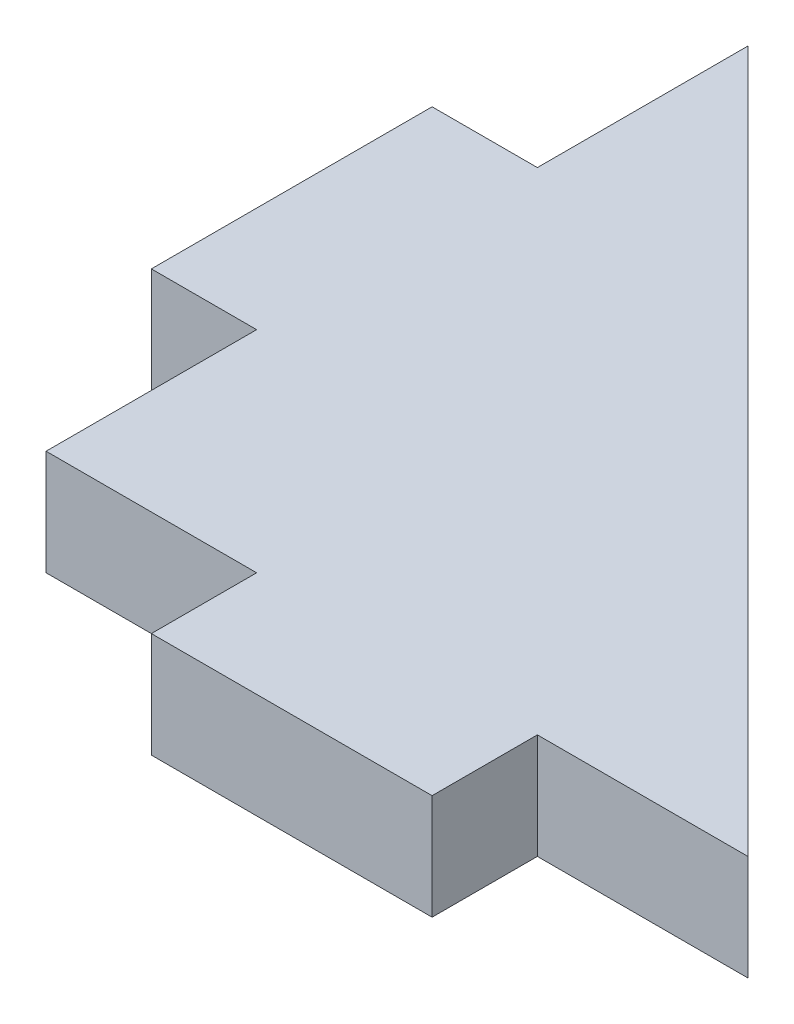
ISO-10303-21;
HEADER;
FILE_DESCRIPTION(('STEP AP214'),'2;1');
FILE_NAME('part.step','',(''),(''),'','','');
FILE_SCHEMA(('AUTOMOTIVE_DESIGN { 1 0 10303 214 1 1 1 1 }'));
ENDSEC;
DATA;
#1=APPLICATION_CONTEXT('core data for automotive mechanical design processes');
#2=APPLICATION_PROTOCOL_DEFINITION('international standard','automotive_design',2000,#1);
#3=PRODUCT_CONTEXT('',#1,'mechanical');
#4=PRODUCT('Part','Part','',(#3));
#5=PRODUCT_RELATED_PRODUCT_CATEGORY('part','',(#4));
#6=PRODUCT_DEFINITION_FORMATION('','',#4);
#7=PRODUCT_DEFINITION_CONTEXT('part definition',#1,'design');
#8=PRODUCT_DEFINITION('design','',#6,#7);
#9=PRODUCT_DEFINITION_SHAPE('','',#8);
#10=(LENGTH_UNIT() NAMED_UNIT(*) SI_UNIT(.MILLI.,.METRE.));
#11=(NAMED_UNIT(*) PLANE_ANGLE_UNIT() SI_UNIT($,.RADIAN.));
#12=(NAMED_UNIT(*) SI_UNIT($,.STERADIAN.) SOLID_ANGLE_UNIT());
#13=UNCERTAINTY_MEASURE_WITH_UNIT(LENGTH_MEASURE(1.E-05),#10,'distance_accuracy_value','');
#14=(GEOMETRIC_REPRESENTATION_CONTEXT(3) GLOBAL_UNCERTAINTY_ASSIGNED_CONTEXT((#13)) GLOBAL_UNIT_ASSIGNED_CONTEXT((#10,
#11,#12)) REPRESENTATION_CONTEXT('',''));
#15=CARTESIAN_POINT('',(0.,0.,0.));
#16=DIRECTION('',(0.,0.,1.));
#17=DIRECTION('',(1.,0.,0.));
#18=AXIS2_PLACEMENT_3D('',#15,#16,#17);
#19=CARTESIAN_POINT('',(0.,3.,0.));
#20=DIRECTION('',(1.,0.,0.));
#21=DIRECTION('',(0.,0.,-1.));
#22=AXIS2_PLACEMENT_3D('',#19,#20,#21);
#23=PLANE('',#22);
#24=DIRECTION('',(0.,0.,1.));
#25=VECTOR('',#24,1.);
#26=CARTESIAN_POINT('',(0.,0.,0.));
#27=LINE('',#26,#25);
#28=CARTESIAN_POINT('',(0.,0.,-6.));
#29=VERTEX_POINT('',#28);
#30=CARTESIAN_POINT('',(0.,0.,0.));
#31=VERTEX_POINT('',#30);
#32=EDGE_CURVE('E147',#29,#31,#27,.T.);
#33=ORIENTED_EDGE('',*,*,#32,.T.);
#34=DIRECTION('',(0.,-1.,0.));
#35=VECTOR('',#34,1.);
#36=CARTESIAN_POINT('',(0.,3.,0.));
#37=LINE('',#36,#35);
#38=CARTESIAN_POINT('',(0.,3.,0.));
#39=VERTEX_POINT('',#38);
#40=EDGE_CURVE('E11',#39,#31,#37,.T.);
#41=ORIENTED_EDGE('',*,*,#40,.F.);
#42=DIRECTION('',(0.,0.,1.));
#43=VECTOR('',#42,1.);
#44=CARTESIAN_POINT('',(0.,3.,0.));
#45=LINE('',#44,#43);
#46=CARTESIAN_POINT('',(0.,3.,-6.));
#47=VERTEX_POINT('',#46);
#48=EDGE_CURVE('E168',#47,#39,#45,.T.);
#49=ORIENTED_EDGE('',*,*,#48,.F.);
#50=DIRECTION('',(0.,-1.,0.));
#51=VECTOR('',#50,1.);
#52=CARTESIAN_POINT('',(0.,3.,-6.));
#53=LINE('',#52,#51);
#54=EDGE_CURVE('E143',#47,#29,#53,.T.);
#55=ORIENTED_EDGE('',*,*,#54,.T.);
#56=EDGE_LOOP('',(#33,#41,#49,#55));
#57=FACE_BOUND('',#56,.T.);
#58=ADVANCED_FACE('F33',(#57),#23,.F.);
#59=CARTESIAN_POINT('',(0.,3.,0.));
#60=DIRECTION('',(0.,0.,-1.));
#61=DIRECTION('',(-1.,0.,0.));
#62=AXIS2_PLACEMENT_3D('',#59,#60,#61);
#63=PLANE('',#62);
#64=DIRECTION('',(1.,0.,0.));
#65=VECTOR('',#64,1.);
#66=CARTESIAN_POINT('',(0.,0.,0.));
#67=LINE('',#66,#65);
#68=CARTESIAN_POINT('',(6.,0.,0.));
#69=VERTEX_POINT('',#68);
#70=EDGE_CURVE('E150',#31,#69,#67,.T.);
#71=ORIENTED_EDGE('',*,*,#70,.T.);
#72=DIRECTION('',(0.,-1.,0.));
#73=VECTOR('',#72,1.);
#74=CARTESIAN_POINT('',(6.,3.,0.));
#75=LINE('',#74,#73);
#76=CARTESIAN_POINT('',(6.,3.,0.));
#77=VERTEX_POINT('',#76);
#78=EDGE_CURVE('E41',#77,#69,#75,.T.);
#79=ORIENTED_EDGE('',*,*,#78,.F.);
#80=DIRECTION('',(1.,0.,0.));
#81=VECTOR('',#80,1.);
#82=CARTESIAN_POINT('',(0.,3.,0.));
#83=LINE('',#82,#81);
#84=EDGE_CURVE('E100',#39,#77,#83,.T.);
#85=ORIENTED_EDGE('',*,*,#84,.F.);
#86=ORIENTED_EDGE('',*,*,#40,.T.);
#87=EDGE_LOOP('',(#71,#79,#85,#86));
#88=FACE_BOUND('',#87,.T.);
#89=ADVANCED_FACE('F239',(#88),#63,.F.);
#90=CARTESIAN_POINT('',(6.,3.,3.));
#91=DIRECTION('',(1.,0.,0.));
#92=DIRECTION('',(0.,0.,-1.));
#93=AXIS2_PLACEMENT_3D('',#90,#91,#92);
#94=PLANE('',#93);
#95=DIRECTION('',(0.,0.,1.));
#96=VECTOR('',#95,1.);
#97=CARTESIAN_POINT('',(6.,0.,3.));
#98=LINE('',#97,#96);
#99=CARTESIAN_POINT('',(6.,0.,3.));
#100=VERTEX_POINT('',#99);
#101=EDGE_CURVE('E152',#69,#100,#98,.T.);
#102=ORIENTED_EDGE('',*,*,#101,.T.);
#103=DIRECTION('',(0.,-1.,0.));
#104=VECTOR('',#103,1.);
#105=CARTESIAN_POINT('',(6.,3.,3.));
#106=LINE('',#105,#104);
#107=CARTESIAN_POINT('',(6.,3.,3.));
#108=VERTEX_POINT('',#107);
#109=EDGE_CURVE('E184',#108,#100,#106,.T.);
#110=ORIENTED_EDGE('',*,*,#109,.F.);
#111=DIRECTION('',(0.,0.,1.));
#112=VECTOR('',#111,1.);
#113=CARTESIAN_POINT('',(6.,3.,3.));
#114=LINE('',#113,#112);
#115=EDGE_CURVE('E192',#77,#108,#114,.T.);
#116=ORIENTED_EDGE('',*,*,#115,.F.);
#117=ORIENTED_EDGE('',*,*,#78,.T.);
#118=EDGE_LOOP('',(#102,#110,#116,#117));
#119=FACE_BOUND('',#118,.T.);
#120=ADVANCED_FACE('F190',(#119),#94,.F.);
#121=CARTESIAN_POINT('',(10.,3.,3.));
#122=DIRECTION('',(0.,0.,-1.));
#123=DIRECTION('',(-1.,0.,0.));
#124=AXIS2_PLACEMENT_3D('',#121,#122,#123);
#125=PLANE('',#124);
#126=DIRECTION('',(1.,0.,0.));
#127=VECTOR('',#126,1.);
#128=CARTESIAN_POINT('',(10.,0.,3.));
#129=LINE('',#128,#127);
#130=CARTESIAN_POINT('',(14.,0.,3.));
#131=VERTEX_POINT('',#130);
#132=EDGE_CURVE('E155',#100,#131,#129,.T.);
#133=ORIENTED_EDGE('',*,*,#132,.T.);
#134=DIRECTION('',(0.,-1.,0.));
#135=VECTOR('',#134,1.);
#136=CARTESIAN_POINT('',(14.,3.,3.));
#137=LINE('',#136,#135);
#138=CARTESIAN_POINT('',(14.,3.,3.));
#139=VERTEX_POINT('',#138);
#140=EDGE_CURVE('E181',#139,#131,#137,.T.);
#141=ORIENTED_EDGE('',*,*,#140,.F.);
#142=DIRECTION('',(1.,0.,0.));
#143=VECTOR('',#142,1.);
#144=CARTESIAN_POINT('',(10.,3.,3.));
#145=LINE('',#144,#143);
#146=EDGE_CURVE('E209',#108,#139,#145,.T.);
#147=ORIENTED_EDGE('',*,*,#146,.F.);
#148=ORIENTED_EDGE('',*,*,#109,.T.);
#149=EDGE_LOOP('',(#133,#141,#147,#148));
#150=FACE_BOUND('',#149,.T.);
#151=ADVANCED_FACE('F200',(#150),#125,.F.);
#152=CARTESIAN_POINT('',(14.,3.,3.));
#153=DIRECTION('',(-1.,0.,0.));
#154=DIRECTION('',(0.,0.,1.));
#155=AXIS2_PLACEMENT_3D('',#152,#153,#154);
#156=PLANE('',#155);
#157=DIRECTION('',(0.,0.,-1.));
#158=VECTOR('',#157,1.);
#159=CARTESIAN_POINT('',(14.,0.,3.));
#160=LINE('',#159,#158);
#161=CARTESIAN_POINT('',(14.,0.,0.));
#162=VERTEX_POINT('',#161);
#163=EDGE_CURVE('E157',#131,#162,#160,.T.);
#164=ORIENTED_EDGE('',*,*,#163,.T.);
#165=DIRECTION('',(0.,-1.,0.));
#166=VECTOR('',#165,1.);
#167=CARTESIAN_POINT('',(14.,3.,0.));
#168=LINE('',#167,#166);
#169=CARTESIAN_POINT('',(14.,3.,0.));
#170=VERTEX_POINT('',#169);
#171=EDGE_CURVE('E178',#170,#162,#168,.T.);
#172=ORIENTED_EDGE('',*,*,#171,.F.);
#173=DIRECTION('',(0.,0.,-1.));
#174=VECTOR('',#173,1.);
#175=CARTESIAN_POINT('',(14.,3.,3.));
#176=LINE('',#175,#174);
#177=EDGE_CURVE('E206',#139,#170,#176,.T.);
#178=ORIENTED_EDGE('',*,*,#177,.F.);
#179=ORIENTED_EDGE('',*,*,#140,.T.);
#180=EDGE_LOOP('',(#164,#172,#178,#179));
#181=FACE_BOUND('',#180,.T.);
#182=ADVANCED_FACE('F204',(#181),#156,.F.);
#183=CARTESIAN_POINT('',(14.,3.,0.));
#184=DIRECTION('',(0.,0.,-1.));
#185=DIRECTION('',(-1.,0.,0.));
#186=AXIS2_PLACEMENT_3D('',#183,#184,#185);
#187=PLANE('',#186);
#188=DIRECTION('',(1.,0.,0.));
#189=VECTOR('',#188,1.);
#190=CARTESIAN_POINT('',(14.,0.,0.));
#191=LINE('',#190,#189);
#192=CARTESIAN_POINT('',(20.,0.,0.));
#193=VERTEX_POINT('',#192);
#194=EDGE_CURVE('E159',#162,#193,#191,.T.);
#195=ORIENTED_EDGE('',*,*,#194,.T.);
#196=DIRECTION('',(0.,-1.,0.));
#197=VECTOR('',#196,1.);
#198=CARTESIAN_POINT('',(20.,3.,0.));
#199=LINE('',#198,#197);
#200=CARTESIAN_POINT('',(20.,3.,0.));
#201=VERTEX_POINT('',#200);
#202=EDGE_CURVE('E175',#201,#193,#199,.T.);
#203=ORIENTED_EDGE('',*,*,#202,.F.);
#204=DIRECTION('',(1.,0.,0.));
#205=VECTOR('',#204,1.);
#206=CARTESIAN_POINT('',(14.,3.,0.));
#207=LINE('',#206,#205);
#208=EDGE_CURVE('E208',#170,#201,#207,.T.);
#209=ORIENTED_EDGE('',*,*,#208,.F.);
#210=ORIENTED_EDGE('',*,*,#171,.T.);
#211=EDGE_LOOP('',(#195,#203,#209,#210));
#212=FACE_BOUND('',#211,.T.);
#213=ADVANCED_FACE('F252',(#212),#187,.F.);
#214=CARTESIAN_POINT('',(0.,3.,-20.));
#215=DIRECTION('',(-0.707106781186547,0.,0.707106781186547));
#216=DIRECTION('',(0.707106781186548,0.,0.707106781186548));
#217=AXIS2_PLACEMENT_3D('',#214,#215,#216);
#218=PLANE('',#217);
#219=DIRECTION('',(-0.707106781186548,0.,-0.707106781186548));
#220=VECTOR('',#219,1.);
#221=CARTESIAN_POINT('',(0.,0.,-20.));
#222=LINE('',#221,#220);
#223=CARTESIAN_POINT('',(0.,0.,-20.));
#224=VERTEX_POINT('',#223);
#225=EDGE_CURVE('E161',#193,#224,#222,.T.);
#226=ORIENTED_EDGE('',*,*,#225,.T.);
#227=DIRECTION('',(0.,-1.,0.));
#228=VECTOR('',#227,1.);
#229=CARTESIAN_POINT('',(0.,3.,-20.));
#230=LINE('',#229,#228);
#231=CARTESIAN_POINT('',(0.,3.,-20.));
#232=VERTEX_POINT('',#231);
#233=EDGE_CURVE('E172',#232,#224,#230,.T.);
#234=ORIENTED_EDGE('',*,*,#233,.F.);
#235=DIRECTION('',(-0.707106781186548,0.,-0.707106781186548));
#236=VECTOR('',#235,1.);
#237=CARTESIAN_POINT('',(0.,3.,-20.));
#238=LINE('',#237,#236);
#239=EDGE_CURVE('E211',#201,#232,#238,.T.);
#240=ORIENTED_EDGE('',*,*,#239,.F.);
#241=ORIENTED_EDGE('',*,*,#202,.T.);
#242=EDGE_LOOP('',(#226,#234,#240,#241));
#243=FACE_BOUND('',#242,.T.);
#244=ADVANCED_FACE('F220',(#243),#218,.F.);
#245=CARTESIAN_POINT('',(0.,3.,-14.));
#246=DIRECTION('',(1.,0.,0.));
#247=DIRECTION('',(0.,0.,-1.));
#248=AXIS2_PLACEMENT_3D('',#245,#246,#247);
#249=PLANE('',#248);
#250=DIRECTION('',(0.,0.,1.));
#251=VECTOR('',#250,1.);
#252=CARTESIAN_POINT('',(0.,0.,-14.));
#253=LINE('',#252,#251);
#254=CARTESIAN_POINT('',(0.,0.,-14.));
#255=VERTEX_POINT('',#254);
#256=EDGE_CURVE('E163',#224,#255,#253,.T.);
#257=ORIENTED_EDGE('',*,*,#256,.T.);
#258=DIRECTION('',(0.,-1.,0.));
#259=VECTOR('',#258,1.);
#260=CARTESIAN_POINT('',(0.,3.,-14.));
#261=LINE('',#260,#259);
#262=CARTESIAN_POINT('',(0.,3.,-14.));
#263=VERTEX_POINT('',#262);
#264=EDGE_CURVE('E138',#263,#255,#261,.T.);
#265=ORIENTED_EDGE('',*,*,#264,.F.);
#266=DIRECTION('',(0.,0.,1.));
#267=VECTOR('',#266,1.);
#268=CARTESIAN_POINT('',(0.,3.,-14.));
#269=LINE('',#268,#267);
#270=EDGE_CURVE('E128',#232,#263,#269,.T.);
#271=ORIENTED_EDGE('',*,*,#270,.F.);
#272=ORIENTED_EDGE('',*,*,#233,.T.);
#273=EDGE_LOOP('',(#257,#265,#271,#272));
#274=FACE_BOUND('',#273,.T.);
#275=ADVANCED_FACE('F224',(#274),#249,.F.);
#276=CARTESIAN_POINT('',(-3.,3.,-14.));
#277=DIRECTION('',(0.,0.,1.));
#278=DIRECTION('',(1.,0.,0.));
#279=AXIS2_PLACEMENT_3D('',#276,#277,#278);
#280=PLANE('',#279);
#281=DIRECTION('',(-1.,0.,0.));
#282=VECTOR('',#281,1.);
#283=CARTESIAN_POINT('',(-3.,0.,-14.));
#284=LINE('',#283,#282);
#285=CARTESIAN_POINT('',(-3.,0.,-14.));
#286=VERTEX_POINT('',#285);
#287=EDGE_CURVE('E137',#255,#286,#284,.T.);
#288=ORIENTED_EDGE('',*,*,#287,.T.);
#289=DIRECTION('',(0.,-1.,0.));
#290=VECTOR('',#289,1.);
#291=CARTESIAN_POINT('',(-3.,3.,-14.));
#292=LINE('',#291,#290);
#293=CARTESIAN_POINT('',(-3.,3.,-14.));
#294=VERTEX_POINT('',#293);
#295=EDGE_CURVE('E134',#294,#286,#292,.T.);
#296=ORIENTED_EDGE('',*,*,#295,.F.);
#297=DIRECTION('',(-1.,0.,0.));
#298=VECTOR('',#297,1.);
#299=CARTESIAN_POINT('',(-3.,3.,-14.));
#300=LINE('',#299,#298);
#301=EDGE_CURVE('E122',#263,#294,#300,.T.);
#302=ORIENTED_EDGE('',*,*,#301,.F.);
#303=ORIENTED_EDGE('',*,*,#264,.T.);
#304=EDGE_LOOP('',(#288,#296,#302,#303));
#305=FACE_BOUND('',#304,.T.);
#306=ADVANCED_FACE('F135',(#305),#280,.F.);
#307=CARTESIAN_POINT('',(-3.,3.,-10.));
#308=DIRECTION('',(1.,0.,0.));
#309=DIRECTION('',(0.,0.,-1.));
#310=AXIS2_PLACEMENT_3D('',#307,#308,#309);
#311=PLANE('',#310);
#312=DIRECTION('',(0.,0.,1.));
#313=VECTOR('',#312,1.);
#314=CARTESIAN_POINT('',(-3.,0.,-10.));
#315=LINE('',#314,#313);
#316=CARTESIAN_POINT('',(-3.,0.,-6.));
#317=VERTEX_POINT('',#316);
#318=EDGE_CURVE('E86',#286,#317,#315,.T.);
#319=ORIENTED_EDGE('',*,*,#318,.T.);
#320=DIRECTION('',(0.,-1.,0.));
#321=VECTOR('',#320,1.);
#322=CARTESIAN_POINT('',(-3.,3.,-6.));
#323=LINE('',#322,#321);
#324=CARTESIAN_POINT('',(-3.,3.,-6.));
#325=VERTEX_POINT('',#324);
#326=EDGE_CURVE('E139',#325,#317,#323,.T.);
#327=ORIENTED_EDGE('',*,*,#326,.F.);
#328=DIRECTION('',(0.,0.,1.));
#329=VECTOR('',#328,1.);
#330=CARTESIAN_POINT('',(-3.,3.,-10.));
#331=LINE('',#330,#329);
#332=EDGE_CURVE('E126',#294,#325,#331,.T.);
#333=ORIENTED_EDGE('',*,*,#332,.F.);
#334=ORIENTED_EDGE('',*,*,#295,.T.);
#335=EDGE_LOOP('',(#319,#327,#333,#334));
#336=FACE_BOUND('',#335,.T.);
#337=ADVANCED_FACE('F141',(#336),#311,.F.);
#338=CARTESIAN_POINT('',(-3.,3.,-6.));
#339=DIRECTION('',(0.,0.,-1.));
#340=DIRECTION('',(-1.,0.,0.));
#341=AXIS2_PLACEMENT_3D('',#338,#339,#340);
#342=PLANE('',#341);
#343=DIRECTION('',(1.,0.,0.));
#344=VECTOR('',#343,1.);
#345=CARTESIAN_POINT('',(-3.,0.,-6.));
#346=LINE('',#345,#344);
#347=EDGE_CURVE('E92',#317,#29,#346,.T.);
#348=ORIENTED_EDGE('',*,*,#347,.T.);
#349=ORIENTED_EDGE('',*,*,#54,.F.);
#350=DIRECTION('',(1.,0.,0.));
#351=VECTOR('',#350,1.);
#352=CARTESIAN_POINT('',(-3.,3.,-6.));
#353=LINE('',#352,#351);
#354=EDGE_CURVE('E49',#325,#47,#353,.T.);
#355=ORIENTED_EDGE('',*,*,#354,.F.);
#356=ORIENTED_EDGE('',*,*,#326,.T.);
#357=EDGE_LOOP('',(#348,#349,#355,#356));
#358=FACE_BOUND('',#357,.T.);
#359=ADVANCED_FACE('F228',(#358),#342,.F.);
#360=CARTESIAN_POINT('',(0.,3.,0.));
#361=DIRECTION('',(0.,-1.,0.));
#362=DIRECTION('',(0.,0.,-1.));
#363=AXIS2_PLACEMENT_3D('',#360,#361,#362);
#364=PLANE('',#363);
#365=ORIENTED_EDGE('',*,*,#48,.T.);
#366=ORIENTED_EDGE('',*,*,#84,.T.);
#367=ORIENTED_EDGE('',*,*,#115,.T.);
#368=ORIENTED_EDGE('',*,*,#146,.T.);
#369=ORIENTED_EDGE('',*,*,#177,.T.);
#370=ORIENTED_EDGE('',*,*,#208,.T.);
#371=ORIENTED_EDGE('',*,*,#239,.T.);
#372=ORIENTED_EDGE('',*,*,#270,.T.);
#373=ORIENTED_EDGE('',*,*,#301,.T.);
#374=ORIENTED_EDGE('',*,*,#332,.T.);
#375=ORIENTED_EDGE('',*,*,#354,.T.);
#376=EDGE_LOOP('',(#365,#366,#367,#368,#369,#370,#371,#372,#373,#374,#375));
#377=FACE_BOUND('',#376,.T.);
#378=ADVANCED_FACE('F124',(#377),#364,.F.);
#379=CARTESIAN_POINT('',(0.,0.,0.));
#380=DIRECTION('',(0.,-1.,0.));
#381=DIRECTION('',(0.,0.,-1.));
#382=AXIS2_PLACEMENT_3D('',#379,#380,#381);
#383=PLANE('',#382);
#384=ORIENTED_EDGE('',*,*,#32,.F.);
#385=ORIENTED_EDGE('',*,*,#347,.F.);
#386=ORIENTED_EDGE('',*,*,#318,.F.);
#387=ORIENTED_EDGE('',*,*,#287,.F.);
#388=ORIENTED_EDGE('',*,*,#256,.F.);
#389=ORIENTED_EDGE('',*,*,#225,.F.);
#390=ORIENTED_EDGE('',*,*,#194,.F.);
#391=ORIENTED_EDGE('',*,*,#163,.F.);
#392=ORIENTED_EDGE('',*,*,#132,.F.);
#393=ORIENTED_EDGE('',*,*,#101,.F.);
#394=ORIENTED_EDGE('',*,*,#70,.F.);
#395=EDGE_LOOP('',(#384,#385,#386,#387,#388,#389,#390,#391,#392,#393,#394));
#396=FACE_BOUND('',#395,.T.);
#397=ADVANCED_FACE('F195',(#396),#383,.T.);
#398=CLOSED_SHELL('',(#58,#89,#120,#151,#182,#213,#244,#275,#306,#337,#359,#378,#397));
#399=MANIFOLD_SOLID_BREP('B2',#398);
#400=ADVANCED_BREP_SHAPE_REPRESENTATION('',(#18,#399),#14);
#401=SHAPE_DEFINITION_REPRESENTATION(#9,#400);
ENDSEC;
END-ISO-10303-21;
